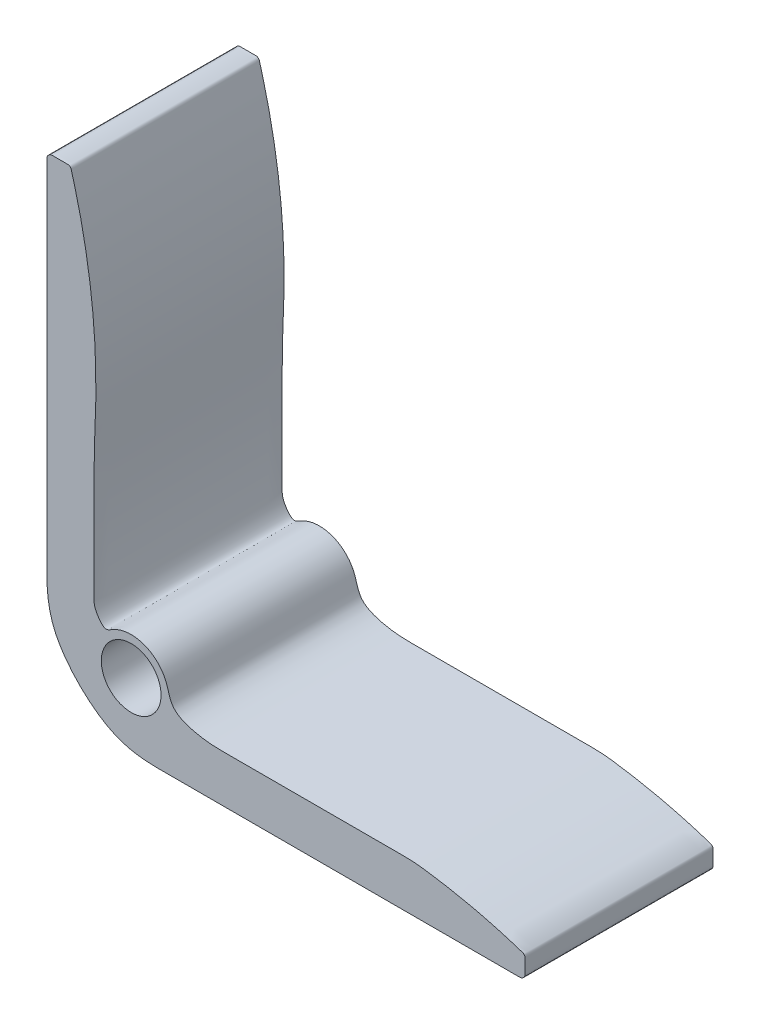
ISO-10303-21;
HEADER;
FILE_DESCRIPTION(('STEP AP214'),'2;1');
FILE_NAME('part.step','',(''),(''),'','','');
FILE_SCHEMA(('AUTOMOTIVE_DESIGN { 1 0 10303 214 1 1 1 1 }'));
ENDSEC;
DATA;
#1=APPLICATION_CONTEXT('core data for automotive mechanical design processes');
#2=APPLICATION_PROTOCOL_DEFINITION('international standard','automotive_design',2000,#1);
#3=PRODUCT_CONTEXT('',#1,'mechanical');
#4=PRODUCT('Part','Part','',(#3));
#5=PRODUCT_RELATED_PRODUCT_CATEGORY('part','',(#4));
#6=PRODUCT_DEFINITION_FORMATION('','',#4);
#7=PRODUCT_DEFINITION_CONTEXT('part definition',#1,'design');
#8=PRODUCT_DEFINITION('design','',#6,#7);
#9=PRODUCT_DEFINITION_SHAPE('','',#8);
#10=(LENGTH_UNIT() NAMED_UNIT(*) SI_UNIT(.MILLI.,.METRE.));
#11=(NAMED_UNIT(*) PLANE_ANGLE_UNIT() SI_UNIT($,.RADIAN.));
#12=(NAMED_UNIT(*) SI_UNIT($,.STERADIAN.) SOLID_ANGLE_UNIT());
#13=UNCERTAINTY_MEASURE_WITH_UNIT(LENGTH_MEASURE(1.E-05),#10,'distance_accuracy_value','');
#14=(GEOMETRIC_REPRESENTATION_CONTEXT(3) GLOBAL_UNCERTAINTY_ASSIGNED_CONTEXT((#13)) GLOBAL_UNIT_ASSIGNED_CONTEXT((#10,
#11,#12)) REPRESENTATION_CONTEXT('',''));
#15=CARTESIAN_POINT('',(0.,0.,0.));
#16=DIRECTION('',(0.,0.,1.));
#17=DIRECTION('',(1.,0.,0.));
#18=AXIS2_PLACEMENT_3D('',#15,#16,#17);
#19=CARTESIAN_POINT('',(-8.54708925192722,-20.6772704200731,20.));
#20=DIRECTION('',(0.,0.,1.));
#21=DIRECTION('',(1.,0.,0.));
#22=AXIS2_PLACEMENT_3D('',#19,#20,#21);
#23=PLANE('',#22);
#24=CARTESIAN_POINT('',(-24.9529597170454,-13.1470402829546,20.));
#25=CARTESIAN_POINT('',(-24.9529597170454,-15.1426527543033,20.));
#26=CARTESIAN_POINT('',(-24.9529597170454,-19.1338776970007,20.));
#27=CARTESIAN_POINT('',(-18.2397971310915,-25.8470402829546,20.));
#28=CARTESIAN_POINT('',(-14.2485721883941,-25.8470402829546,20.));
#29=CARTESIAN_POINT('',(-12.2529597170454,-25.8470402829546,20.));
#30=CARTESIAN_POINT('',(0.251362527083696,-25.8470402829546,20.));
#31=CARTESIAN_POINT('',(12.7556847712128,-25.8470402829546,20.));
#32=CARTESIAN_POINT('',(25.2600070153419,-25.8470402829546,20.));
#33=CARTESIAN_POINT('',(25.3522503940777,-25.8470402829546,20.));
#34=CARTESIAN_POINT('',(25.5367371515493,-25.8470402829546,20.));
#35=CARTESIAN_POINT('',(25.8470402829546,-25.5367371515493,20.));
#36=CARTESIAN_POINT('',(25.8470402829546,-25.3522503940777,20.));
#37=CARTESIAN_POINT('',(25.8470402829546,-25.2600070153419,20.));
#38=CARTESIAN_POINT('',(25.8470402829546,-24.8686515036001,20.));
#39=CARTESIAN_POINT('',(25.8470402829546,-24.4772959918583,20.));
#40=CARTESIAN_POINT('',(25.8470402829546,-24.0859404801165,20.));
#41=CARTESIAN_POINT('',(25.8470402829546,-24.0532166631451,20.));
#42=CARTESIAN_POINT('',(25.8470402829546,-23.9877690292022,20.));
#43=CARTESIAN_POINT('',(25.8470402829546,-23.8895975782878,20.));
#44=CARTESIAN_POINT('',(25.8470402829546,-23.8241499443449,20.));
#45=CARTESIAN_POINT('',(25.8470402829546,-23.7914261273734,20.));
#46=CARTESIAN_POINT('',(25.8470402829546,-23.738586097074,20.));
#47=CARTESIAN_POINT('',(25.8470402829546,-23.6329060364753,20.));
#48=CARTESIAN_POINT('',(25.7190952310175,-23.45573901101,20.));
#49=CARTESIAN_POINT('',(25.6187763967001,-23.4225063961665,20.));
#50=CARTESIAN_POINT('',(25.5686169795414,-23.4058900887448,20.));
#51=CARTESIAN_POINT('',(25.5376549587561,-23.3956333017861,20.));
#52=CARTESIAN_POINT('',(25.4757309171854,-23.3751197278688,20.));
#53=CARTESIAN_POINT('',(25.3827494927691,-23.3446371240555,20.));
#54=CARTESIAN_POINT('',(25.3207393194152,-23.324385332089,20.));
#55=CARTESIAN_POINT('',(25.2897256992334,-23.3142856403585,20.));
#56=CARTESIAN_POINT('',(22.5754254080698,-22.4303644456057,20.));
#57=CARTESIAN_POINT('',(19.8032844245329,-21.7492057882144,20.));
#58=CARTESIAN_POINT('',(16.9884270911855,-21.2745259571233,20.));
#59=CARTESIAN_POINT('',(16.8214723743368,-21.2463717640654,20.));
#60=CARTESIAN_POINT('',(16.4873159729544,-21.1915278994104,20.));
#61=CARTESIAN_POINT('',(15.985543890989,-21.1121849757709,20.));
#62=CARTESIAN_POINT('',(15.6502684000808,-21.0646824552557,20.));
#63=CARTESIAN_POINT('',(15.4826306546267,-21.0409311949981,20.));
#64=CARTESIAN_POINT('',(15.1792737922634,-20.9979509713653,20.));
#65=CARTESIAN_POINT('',(14.5725600675369,-20.9119905240997,20.));
#66=CARTESIAN_POINT('',(13.6511367969657,-20.8470402829546,20.));
#67=CARTESIAN_POINT('',(13.0383638028923,-20.8470402829546,20.));
#68=CARTESIAN_POINT('',(12.7319773058557,-20.8470402829546,20.));
#69=CARTESIAN_POINT('',(12.5310751212408,-20.8470402829546,20.));
#70=CARTESIAN_POINT('',(12.129270752011,-20.8470402829546,20.));
#71=CARTESIAN_POINT('',(11.5265641981662,-20.8470402829546,20.));
#72=CARTESIAN_POINT('',(11.1247598289364,-20.8470402829546,20.));
#73=CARTESIAN_POINT('',(10.9238576443215,-20.8470402829546,20.));
#74=CARTESIAN_POINT('',(5.32816764755489,-20.8470402829546,20.));
#75=CARTESIAN_POINT('',(-0.267522349211758,-20.8470402829546,20.));
#76=CARTESIAN_POINT('',(-5.86321234597841,-20.8470402829546,20.));
#77=CARTESIAN_POINT('',(-6.6685554395357,-20.8470402829546,20.));
#78=CARTESIAN_POINT('',(-8.2792416266503,-20.8470402829546,20.));
#79=CARTESIAN_POINT('',(-11.8411488005779,-19.9027938366965,20.));
#80=CARTESIAN_POINT('',(-11.9834150092492,-18.226283322826,20.));
#81=CARTESIAN_POINT('',(-12.2805992232261,-17.4777787862309,20.));
#82=CARTESIAN_POINT('',(-13.2675378775321,-14.992020709772,20.));
#83=CARTESIAN_POINT('',(-15.8047114761685,-14.1459762355112,20.));
#84=CARTESIAN_POINT('',(-18.0860341431875,-15.5419017388923,20.));
#85=CARTESIAN_POINT('',(-18.3437370757381,-15.6995883743885,20.));
#86=CARTESIAN_POINT('',(-18.823412847049,-16.0733543552076,20.));
#87=CARTESIAN_POINT('',(-19.9529597170454,-14.471408930778,20.));
#88=CARTESIAN_POINT('',(-19.9529597170454,-13.86717097613,20.));
#89=CARTESIAN_POINT('',(-19.9529597170454,-13.565051998806,20.));
#90=CARTESIAN_POINT('',(-19.9529597170454,-10.3728604068201,20.));
#91=CARTESIAN_POINT('',(-19.9529597170454,-7.18066881483428,20.));
#92=CARTESIAN_POINT('',(-19.9529597170454,-3.98847722284843,20.));
#93=CARTESIAN_POINT('',(-19.9529597170454,-2.77862434782929,20.));
#94=CARTESIAN_POINT('',(-19.9529597170454,-0.358918597791009,20.));
#95=CARTESIAN_POINT('',(-19.7725722461916,3.26826756823599,20.));
#96=CARTESIAN_POINT('',(-19.7376175900241,5.68859935457452,20.));
#97=CARTESIAN_POINT('',(-19.7527408862211,6.89835770445445,20.));
#98=CARTESIAN_POINT('',(-19.8266481087117,12.8104206806606,20.));
#99=CARTESIAN_POINT('',(-20.6740364958862,18.6619062897556,20.));
#100=CARTESIAN_POINT('',(-22.2803148241335,24.3520575042987,20.));
#101=CARTESIAN_POINT('',(-22.2897511647669,24.3854852136636,20.));
#102=CARTESIAN_POINT('',(-22.3086755694418,24.4523260313421,20.));
#103=CARTESIAN_POINT('',(-22.3371657007741,24.5525583255127,20.));
#104=CARTESIAN_POINT('',(-22.3563485183218,24.6193254178761,20.));
#105=CARTESIAN_POINT('',(-22.3659399270956,24.6527089640578,20.));
#106=CARTESIAN_POINT('',(-22.3812527547078,24.7060062950148,20.));
#107=CARTESIAN_POINT('',(-22.4118784099322,24.8126009569288,20.));
#108=CARTESIAN_POINT('',(-22.5982417920678,24.9529597170454,20.));
#109=CARTESIAN_POINT('',(-22.7091487472442,24.9529597170454,20.));
#110=CARTESIAN_POINT('',(-22.7646022248323,24.9529597170454,20.));
#111=CARTESIAN_POINT('',(-22.7994197239671,24.9529597170454,20.));
#112=CARTESIAN_POINT('',(-22.8690547222367,24.9529597170454,20.));
#113=CARTESIAN_POINT('',(-22.9735072196411,24.9529597170454,20.));
#114=CARTESIAN_POINT('',(-23.0431422179106,24.9529597170454,20.));
#115=CARTESIAN_POINT('',(-23.0779597170454,24.9529597170454,20.));
#116=CARTESIAN_POINT('',(-23.4946263837121,24.9529597170454,20.));
#117=CARTESIAN_POINT('',(-23.9112930503788,24.9529597170454,20.));
#118=CARTESIAN_POINT('',(-24.3279597170454,24.9529597170454,20.));
#119=CARTESIAN_POINT('',(-24.4261689922102,24.9529597170454,20.));
#120=CARTESIAN_POINT('',(-24.6225875425398,24.9529597170454,20.));
#121=CARTESIAN_POINT('',(-24.9529597170454,24.6225875425398,20.));
#122=CARTESIAN_POINT('',(-24.9529597170454,24.4261689922102,20.));
#123=CARTESIAN_POINT('',(-24.9529597170454,24.3279597170454,20.));
#124=CARTESIAN_POINT('',(-24.9529597170454,11.8362930503787,20.));
#125=CARTESIAN_POINT('',(-24.9529597170454,-0.655373616287916,20.));
#126=CARTESIAN_POINT('',(-24.9529597170454,-13.1470402829546,20.));
#127=(BOUNDED_CURVE() B_SPLINE_CURVE(3,(#24,#25,#26,#27,#28,#29,#30,#31,#32,#33,#34,#35,#36,#37,
#38,#39,#40,#41,#42,#43,#44,#45,#46,#47,#48,#49,#50,#51,#52,#53,#54,#55,#56,#57,#58,#59,#60,#61,
#62,#63,#64,#65,#66,#67,#68,#69,#70,#71,#72,#73,#74,#75,#76,#77,#78,#79,#80,#81,#82,#83,#84,#85,
#86,#87,#88,#89,#90,#91,#92,#93,#94,#95,#96,#97,#98,#99,#100,#101,#102,#103,#104,#105,#106,#107,
#108,#109,#110,#111,#112,#113,#114,#115,#116,#117,#118,#119,#120,#121,#122,#123,#124,#125,#126),
.UNSPECIFIED.,.T.,.F.) B_SPLINE_CURVE_WITH_KNOTS((4,1,1,3,3,1,1,3,3,1,1,3,1,1,3,1,1,3,3,1,1,3,1,
1,3,1,1,3,3,1,1,3,3,1,1,3,3,1,1,3,3,1,1,3,1,1,3,1,1,3,3,1,1,3,4),(0.,0.0323809104846119,
0.0647618209692237,0.0971427314538356,0.30003850659611,0.301535252398477,0.303031998200843,
0.30452874400321,0.310878898642605,0.311409876977969,0.311940855313333,0.312471833648696,
0.313329218694988,0.31418660374128,0.315043988787571,0.315573228861082,0.316102468934592,
0.316631709008102,0.362866363711306,0.365613628093723,0.36836089247614,0.371108156858557,
0.376079599900067,0.381051042941577,0.386022485983087,0.38928233515199,0.392542184320892,
0.395802033489795,0.486597986855666,0.499665525266194,0.512733063676722,0.52580060208725,
0.558900109466467,0.563802307513876,0.568704505561284,0.573606703608694,0.625403368378963,
0.645034503285164,0.664665638191364,0.684296773097565,0.779683058542622,0.780246655500868,
0.780810252459115,0.781373849417362,0.782273640393628,0.783173431369893,0.784073222346159,
0.784638172875868,0.785203123405576,0.785768073935285,0.792528928674851,0.794122477419172,
0.795716026163493,0.797309574907815,1.),
.UNSPECIFIED.) CURVE() GEOMETRIC_REPRESENTATION_ITEM() RATIONAL_B_SPLINE_CURVE((1.,1.,1.,1.,1.,
1.,1.,1.,1.,1.,1.,1.,1.,1.,1.,1.,1.,1.,1.,1.,1.,1.,1.,1.,1.,1.,1.,1.,1.,1.,1.,1.,
0.998181388482449,0.998181388482449,1.,1.,1.,1.,1.,1.,1.,1.,1.,1.,1.,1.,1.,1.,1.,1.,1.,1.,1.,1.,
1.,1.,1.,1.,0.76271681778517,0.76271681778517,1.,1.,1.,1.,1.,1.,1.,1.,1.,1.,1.,1.,1.,1.,
0.994260316429497,0.994260316429497,1.,1.,1.,1.,1.,1.,1.,1.,1.,1.,1.,1.,1.,1.,1.,1.,1.,1.,1.,1.,
1.,1.,1.,1.,1.,1.,1.)) REPRESENTATION_ITEM(''));
#128=CARTESIAN_POINT('',(-24.9529597170454,-13.1470402829546,20.));
#129=VERTEX_POINT('',#128);
#130=EDGE_CURVE('E10',#129,#129,#127,.T.);
#131=ORIENTED_EDGE('',*,*,#130,.T.);
#132=EDGE_LOOP('',(#131));
#133=FACE_BOUND('',#132,.T.);
#134=CARTESIAN_POINT('',(-15.9982919312561,-18.9538414301119,20.));
#135=DIRECTION('',(0.,0.,1.));
#136=DIRECTION('',(1.,0.,0.));
#137=AXIS2_PLACEMENT_3D('',#134,#135,#136);
#138=CIRCLE('',#137,3.175);
#139=CARTESIAN_POINT('',(-12.8232919312561,-18.9538414301119,20.));
#140=VERTEX_POINT('',#139);
#141=EDGE_CURVE('E44',#140,#140,#138,.T.);
#142=ORIENTED_EDGE('',*,*,#141,.F.);
#143=EDGE_LOOP('',(#142));
#144=FACE_BOUND('',#143,.T.);
#145=ADVANCED_FACE('F31',(#133,#144),#23,.T.);
#146=CARTESIAN_POINT('',(-8.54708925192722,-20.6772704200731,0.));
#147=DIRECTION('',(0.,0.,1.));
#148=DIRECTION('',(1.,0.,0.));
#149=AXIS2_PLACEMENT_3D('',#146,#147,#148);
#150=PLANE('',#149);
#151=CARTESIAN_POINT('',(-24.9529597170454,-13.1470402829546,0.));
#152=CARTESIAN_POINT('',(-24.9529597170454,-15.1426527543033,0.));
#153=CARTESIAN_POINT('',(-24.9529597170454,-19.1338776970007,0.));
#154=CARTESIAN_POINT('',(-18.2397971310915,-25.8470402829546,0.));
#155=CARTESIAN_POINT('',(-14.2485721883941,-25.8470402829546,0.));
#156=CARTESIAN_POINT('',(-12.2529597170454,-25.8470402829546,0.));
#157=CARTESIAN_POINT('',(0.251362527083696,-25.8470402829546,0.));
#158=CARTESIAN_POINT('',(12.7556847712128,-25.8470402829546,0.));
#159=CARTESIAN_POINT('',(25.2600070153419,-25.8470402829546,0.));
#160=CARTESIAN_POINT('',(25.3522503940777,-25.8470402829546,0.));
#161=CARTESIAN_POINT('',(25.5367371515493,-25.8470402829546,0.));
#162=CARTESIAN_POINT('',(25.8470402829546,-25.5367371515493,0.));
#163=CARTESIAN_POINT('',(25.8470402829546,-25.3522503940777,0.));
#164=CARTESIAN_POINT('',(25.8470402829546,-25.2600070153419,0.));
#165=CARTESIAN_POINT('',(25.8470402829546,-24.8686515036001,0.));
#166=CARTESIAN_POINT('',(25.8470402829546,-24.4772959918583,0.));
#167=CARTESIAN_POINT('',(25.8470402829546,-24.0859404801165,0.));
#168=CARTESIAN_POINT('',(25.8470402829546,-24.0532166631451,0.));
#169=CARTESIAN_POINT('',(25.8470402829546,-23.9877690292022,0.));
#170=CARTESIAN_POINT('',(25.8470402829546,-23.8895975782878,0.));
#171=CARTESIAN_POINT('',(25.8470402829546,-23.8241499443449,0.));
#172=CARTESIAN_POINT('',(25.8470402829546,-23.7914261273734,0.));
#173=CARTESIAN_POINT('',(25.8470402829546,-23.738586097074,0.));
#174=CARTESIAN_POINT('',(25.8470402829546,-23.6329060364753,0.));
#175=CARTESIAN_POINT('',(25.7190952310175,-23.45573901101,0.));
#176=CARTESIAN_POINT('',(25.6187763967001,-23.4225063961665,0.));
#177=CARTESIAN_POINT('',(25.5686169795414,-23.4058900887448,0.));
#178=CARTESIAN_POINT('',(25.5376549587561,-23.3956333017861,0.));
#179=CARTESIAN_POINT('',(25.4757309171854,-23.3751197278688,0.));
#180=CARTESIAN_POINT('',(25.3827494927691,-23.3446371240555,0.));
#181=CARTESIAN_POINT('',(25.3207393194152,-23.324385332089,0.));
#182=CARTESIAN_POINT('',(25.2897256992334,-23.3142856403585,0.));
#183=CARTESIAN_POINT('',(22.5754254080698,-22.4303644456057,0.));
#184=CARTESIAN_POINT('',(19.8032844245329,-21.7492057882144,0.));
#185=CARTESIAN_POINT('',(16.9884270911855,-21.2745259571233,0.));
#186=CARTESIAN_POINT('',(16.8214723743368,-21.2463717640654,0.));
#187=CARTESIAN_POINT('',(16.4873159729544,-21.1915278994104,0.));
#188=CARTESIAN_POINT('',(15.985543890989,-21.1121849757709,0.));
#189=CARTESIAN_POINT('',(15.6502684000808,-21.0646824552557,0.));
#190=CARTESIAN_POINT('',(15.4826306546267,-21.0409311949981,0.));
#191=CARTESIAN_POINT('',(15.1792737922634,-20.9979509713653,0.));
#192=CARTESIAN_POINT('',(14.5725600675369,-20.9119905240997,0.));
#193=CARTESIAN_POINT('',(13.6511367969657,-20.8470402829546,0.));
#194=CARTESIAN_POINT('',(13.0383638028923,-20.8470402829546,0.));
#195=CARTESIAN_POINT('',(12.7319773058557,-20.8470402829546,0.));
#196=CARTESIAN_POINT('',(12.5310751212408,-20.8470402829546,0.));
#197=CARTESIAN_POINT('',(12.129270752011,-20.8470402829546,0.));
#198=CARTESIAN_POINT('',(11.5265641981662,-20.8470402829546,0.));
#199=CARTESIAN_POINT('',(11.1247598289364,-20.8470402829546,0.));
#200=CARTESIAN_POINT('',(10.9238576443215,-20.8470402829546,0.));
#201=CARTESIAN_POINT('',(5.32816764755489,-20.8470402829546,0.));
#202=CARTESIAN_POINT('',(-0.267522349211758,-20.8470402829546,0.));
#203=CARTESIAN_POINT('',(-5.86321234597841,-20.8470402829546,0.));
#204=CARTESIAN_POINT('',(-6.6685554395357,-20.8470402829546,0.));
#205=CARTESIAN_POINT('',(-8.2792416266503,-20.8470402829546,0.));
#206=CARTESIAN_POINT('',(-11.8411488005779,-19.9027938366965,0.));
#207=CARTESIAN_POINT('',(-11.9834150092492,-18.226283322826,0.));
#208=CARTESIAN_POINT('',(-12.2805992232261,-17.4777787862309,0.));
#209=CARTESIAN_POINT('',(-13.2675378775321,-14.992020709772,0.));
#210=CARTESIAN_POINT('',(-15.8047114761685,-14.1459762355112,0.));
#211=CARTESIAN_POINT('',(-18.0860341431875,-15.5419017388923,0.));
#212=CARTESIAN_POINT('',(-18.3437370757381,-15.6995883743885,0.));
#213=CARTESIAN_POINT('',(-18.823412847049,-16.0733543552076,0.));
#214=CARTESIAN_POINT('',(-19.9529597170454,-14.471408930778,0.));
#215=CARTESIAN_POINT('',(-19.9529597170454,-13.86717097613,0.));
#216=CARTESIAN_POINT('',(-19.9529597170454,-13.565051998806,0.));
#217=CARTESIAN_POINT('',(-19.9529597170454,-10.3728604068201,0.));
#218=CARTESIAN_POINT('',(-19.9529597170454,-7.18066881483428,0.));
#219=CARTESIAN_POINT('',(-19.9529597170454,-3.98847722284843,0.));
#220=CARTESIAN_POINT('',(-19.9529597170454,-2.77862434782929,0.));
#221=CARTESIAN_POINT('',(-19.9529597170454,-0.358918597791009,0.));
#222=CARTESIAN_POINT('',(-19.7725722461916,3.26826756823599,0.));
#223=CARTESIAN_POINT('',(-19.7376175900241,5.68859935457452,0.));
#224=CARTESIAN_POINT('',(-19.7527408862211,6.89835770445445,0.));
#225=CARTESIAN_POINT('',(-19.8266481087117,12.8104206806606,0.));
#226=CARTESIAN_POINT('',(-20.6740364958862,18.6619062897556,0.));
#227=CARTESIAN_POINT('',(-22.2803148241335,24.3520575042987,0.));
#228=CARTESIAN_POINT('',(-22.2897511647669,24.3854852136636,0.));
#229=CARTESIAN_POINT('',(-22.3086755694418,24.4523260313421,0.));
#230=CARTESIAN_POINT('',(-22.3371657007741,24.5525583255127,0.));
#231=CARTESIAN_POINT('',(-22.3563485183218,24.6193254178761,0.));
#232=CARTESIAN_POINT('',(-22.3659399270956,24.6527089640578,0.));
#233=CARTESIAN_POINT('',(-22.3812527547078,24.7060062950148,0.));
#234=CARTESIAN_POINT('',(-22.4118784099322,24.8126009569288,0.));
#235=CARTESIAN_POINT('',(-22.5982417920678,24.9529597170454,0.));
#236=CARTESIAN_POINT('',(-22.7091487472442,24.9529597170454,0.));
#237=CARTESIAN_POINT('',(-22.7646022248323,24.9529597170454,0.));
#238=CARTESIAN_POINT('',(-22.7994197239671,24.9529597170454,0.));
#239=CARTESIAN_POINT('',(-22.8690547222367,24.9529597170454,0.));
#240=CARTESIAN_POINT('',(-22.9735072196411,24.9529597170454,0.));
#241=CARTESIAN_POINT('',(-23.0431422179106,24.9529597170454,0.));
#242=CARTESIAN_POINT('',(-23.0779597170454,24.9529597170454,0.));
#243=CARTESIAN_POINT('',(-23.4946263837121,24.9529597170454,0.));
#244=CARTESIAN_POINT('',(-23.9112930503788,24.9529597170454,0.));
#245=CARTESIAN_POINT('',(-24.3279597170454,24.9529597170454,0.));
#246=CARTESIAN_POINT('',(-24.4261689922102,24.9529597170454,0.));
#247=CARTESIAN_POINT('',(-24.6225875425398,24.9529597170454,0.));
#248=CARTESIAN_POINT('',(-24.9529597170454,24.6225875425398,0.));
#249=CARTESIAN_POINT('',(-24.9529597170454,24.4261689922102,0.));
#250=CARTESIAN_POINT('',(-24.9529597170454,24.3279597170454,0.));
#251=CARTESIAN_POINT('',(-24.9529597170454,11.8362930503787,0.));
#252=CARTESIAN_POINT('',(-24.9529597170454,-0.655373616287916,0.));
#253=CARTESIAN_POINT('',(-24.9529597170454,-13.1470402829546,0.));
#254=(BOUNDED_CURVE() B_SPLINE_CURVE(3,(#151,#152,#153,#154,#155,#156,#157,#158,#159,#160,#161,
#162,#163,#164,#165,#166,#167,#168,#169,#170,#171,#172,#173,#174,#175,#176,#177,#178,#179,#180,
#181,#182,#183,#184,#185,#186,#187,#188,#189,#190,#191,#192,#193,#194,#195,#196,#197,#198,#199,
#200,#201,#202,#203,#204,#205,#206,#207,#208,#209,#210,#211,#212,#213,#214,#215,#216,#217,#218,
#219,#220,#221,#222,#223,#224,#225,#226,#227,#228,#229,#230,#231,#232,#233,#234,#235,#236,#237,
#238,#239,#240,#241,#242,#243,#244,#245,#246,#247,#248,#249,#250,#251,#252,#253),.UNSPECIFIED.,
.T.,.F.) B_SPLINE_CURVE_WITH_KNOTS((4,1,1,3,3,1,1,3,3,1,1,3,1,1,3,1,1,3,3,1,1,3,1,1,3,1,1,3,3,1,
1,3,3,1,1,3,3,1,1,3,3,1,1,3,1,1,3,1,1,3,3,1,1,3,4),(0.,0.0323809104846119,0.0647618209692237,
0.0971427314538356,0.30003850659611,0.301535252398477,0.303031998200843,0.30452874400321,
0.310878898642605,0.311409876977969,0.311940855313333,0.312471833648696,0.313329218694988,
0.31418660374128,0.315043988787571,0.315573228861082,0.316102468934592,0.316631709008102,
0.362866363711306,0.365613628093723,0.36836089247614,0.371108156858557,0.376079599900067,
0.381051042941577,0.386022485983087,0.38928233515199,0.392542184320892,0.395802033489795,
0.486597986855666,0.499665525266194,0.512733063676722,0.52580060208725,0.558900109466467,
0.563802307513876,0.568704505561284,0.573606703608694,0.625403368378963,0.645034503285164,
0.664665638191364,0.684296773097565,0.779683058542622,0.780246655500868,0.780810252459115,
0.781373849417362,0.782273640393628,0.783173431369893,0.784073222346159,0.784638172875868,
0.785203123405576,0.785768073935285,0.792528928674851,0.794122477419172,0.795716026163493,
0.797309574907815,1.),
.UNSPECIFIED.) CURVE() GEOMETRIC_REPRESENTATION_ITEM() RATIONAL_B_SPLINE_CURVE((1.,1.,1.,1.,1.,
1.,1.,1.,1.,1.,1.,1.,1.,1.,1.,1.,1.,1.,1.,1.,1.,1.,1.,1.,1.,1.,1.,1.,1.,1.,1.,1.,
0.998181388482449,0.998181388482449,1.,1.,1.,1.,1.,1.,1.,1.,1.,1.,1.,1.,1.,1.,1.,1.,1.,1.,1.,1.,
1.,1.,1.,1.,0.76271681778517,0.76271681778517,1.,1.,1.,1.,1.,1.,1.,1.,1.,1.,1.,1.,1.,1.,
0.994260316429497,0.994260316429497,1.,1.,1.,1.,1.,1.,1.,1.,1.,1.,1.,1.,1.,1.,1.,1.,1.,1.,1.,1.,
1.,1.,1.,1.,1.,1.,1.)) REPRESENTATION_ITEM(''));
#255=CARTESIAN_POINT('',(-24.9529597170454,-13.1470402829546,0.));
#256=VERTEX_POINT('',#255);
#257=EDGE_CURVE('E36',#256,#256,#254,.T.);
#258=ORIENTED_EDGE('',*,*,#257,.F.);
#259=EDGE_LOOP('',(#258));
#260=FACE_BOUND('',#259,.T.);
#261=CARTESIAN_POINT('',(-15.9982919312561,-18.9538414301119,0.));
#262=DIRECTION('',(0.,0.,1.));
#263=DIRECTION('',(1.,0.,0.));
#264=AXIS2_PLACEMENT_3D('',#261,#262,#263);
#265=CIRCLE('',#264,3.175);
#266=CARTESIAN_POINT('',(-12.8232919312561,-18.9538414301119,0.));
#267=VERTEX_POINT('',#266);
#268=EDGE_CURVE('E49',#267,#267,#265,.T.);
#269=ORIENTED_EDGE('',*,*,#268,.T.);
#270=EDGE_LOOP('',(#269));
#271=FACE_BOUND('',#270,.T.);
#272=ADVANCED_FACE('F62',(#260,#271),#150,.F.);
#273=DIRECTION('',(0.,0.,-1.));
#274=VECTOR('',#273,1.);
#275=SURFACE_OF_LINEAR_EXTRUSION('',#127,#274);
#276=ORIENTED_EDGE('',*,*,#130,.F.);
#277=EDGE_LOOP('',(#276));
#278=FACE_BOUND('',#277,.T.);
#279=ORIENTED_EDGE('',*,*,#257,.T.);
#280=EDGE_LOOP('',(#279));
#281=FACE_BOUND('',#280,.T.);
#282=ADVANCED_FACE('F33',(#278,#281),#275,.F.);
#283=CARTESIAN_POINT('',(-15.9982919312561,-18.9538414301119,20.));
#284=DIRECTION('',(0.,0.,-1.));
#285=DIRECTION('',(-1.,0.,0.));
#286=AXIS2_PLACEMENT_3D('',#283,#284,#285);
#287=CYLINDRICAL_SURFACE('',#286,3.175);
#288=ORIENTED_EDGE('',*,*,#141,.T.);
#289=EDGE_LOOP('',(#288));
#290=FACE_BOUND('',#289,.T.);
#291=ORIENTED_EDGE('',*,*,#268,.F.);
#292=EDGE_LOOP('',(#291));
#293=FACE_BOUND('',#292,.T.);
#294=ADVANCED_FACE('F58',(#290,#293),#287,.F.);
#295=CLOSED_SHELL('',(#145,#272,#282,#294));
#296=MANIFOLD_SOLID_BREP('B2',#295);
#297=ADVANCED_BREP_SHAPE_REPRESENTATION('',(#18,#296),#14);
#298=SHAPE_DEFINITION_REPRESENTATION(#9,#297);
ENDSEC;
END-ISO-10303-21;
